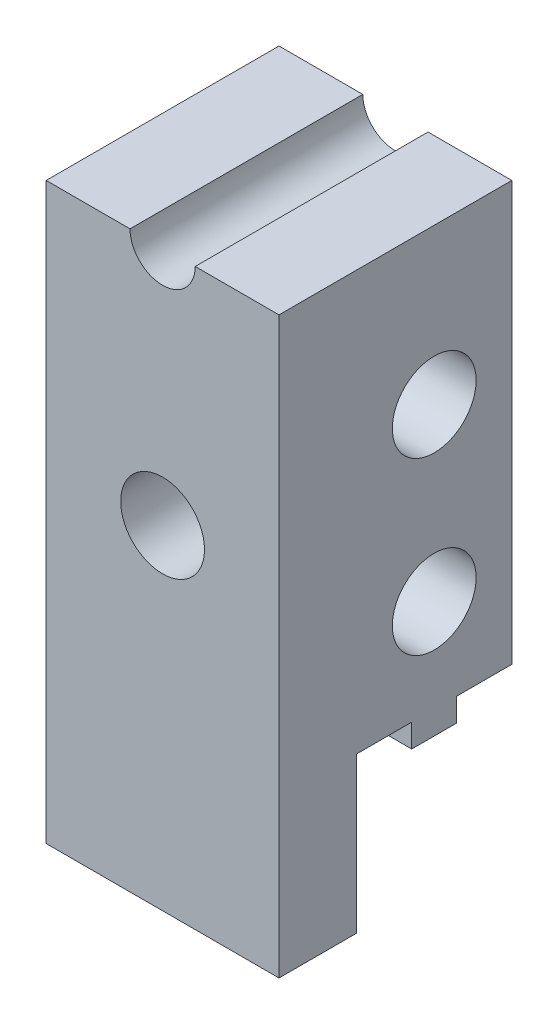
ISO-10303-21;
HEADER;
FILE_DESCRIPTION(('STEP AP214'),'2;1');
FILE_NAME('part.step','',(''),(''),'','','');
FILE_SCHEMA(('AUTOMOTIVE_DESIGN { 1 0 10303 214 1 1 1 1 }'));
ENDSEC;
DATA;
#1=APPLICATION_CONTEXT('core data for automotive mechanical design processes');
#2=APPLICATION_PROTOCOL_DEFINITION('international standard','automotive_design',2000,#1);
#3=PRODUCT_CONTEXT('',#1,'mechanical');
#4=PRODUCT('Part','Part','',(#3));
#5=PRODUCT_RELATED_PRODUCT_CATEGORY('part','',(#4));
#6=PRODUCT_DEFINITION_FORMATION('','',#4);
#7=PRODUCT_DEFINITION_CONTEXT('part definition',#1,'design');
#8=PRODUCT_DEFINITION('design','',#6,#7);
#9=PRODUCT_DEFINITION_SHAPE('','',#8);
#10=(LENGTH_UNIT() NAMED_UNIT(*) SI_UNIT(.MILLI.,.METRE.));
#11=(NAMED_UNIT(*) PLANE_ANGLE_UNIT() SI_UNIT($,.RADIAN.));
#12=(NAMED_UNIT(*) SI_UNIT($,.STERADIAN.) SOLID_ANGLE_UNIT());
#13=UNCERTAINTY_MEASURE_WITH_UNIT(LENGTH_MEASURE(1.E-05),#10,'distance_accuracy_value','');
#14=(GEOMETRIC_REPRESENTATION_CONTEXT(3) GLOBAL_UNCERTAINTY_ASSIGNED_CONTEXT((#13)) GLOBAL_UNIT_ASSIGNED_CONTEXT((#10,
#11,#12)) REPRESENTATION_CONTEXT('',''));
#15=CARTESIAN_POINT('',(0.,0.,0.));
#16=DIRECTION('',(0.,0.,1.));
#17=DIRECTION('',(1.,0.,0.));
#18=AXIS2_PLACEMENT_3D('',#15,#16,#17);
#19=CARTESIAN_POINT('',(30.,-9.15785598684864,-10.));
#20=DIRECTION('',(0.,0.,1.));
#21=DIRECTION('',(1.,0.,0.));
#22=AXIS2_PLACEMENT_3D('',#19,#20,#21);
#23=PLANE('',#22);
#24=CARTESIAN_POINT('',(15.,13.8421440131514,-10.));
#25=DIRECTION('',(0.,0.,1.));
#26=DIRECTION('',(1.,0.,0.));
#27=AXIS2_PLACEMENT_3D('',#24,#25,#26);
#28=CIRCLE('',#27,5.4);
#29=CARTESIAN_POINT('',(20.4,13.8421440131514,-10.));
#30=VERTEX_POINT('',#29);
#31=EDGE_CURVE('E263',#30,#30,#28,.T.);
#32=ORIENTED_EDGE('',*,*,#31,.T.);
#33=EDGE_LOOP('',(#32));
#34=FACE_BOUND('',#33,.T.);
#35=CARTESIAN_POINT('',(15.,44.8421440131514,-10.));
#36=DIRECTION('',(0.,0.,1.));
#37=DIRECTION('',(1.,0.,0.));
#38=AXIS2_PLACEMENT_3D('',#35,#36,#37);
#39=CIRCLE('',#38,4.2);
#40=CARTESIAN_POINT('',(10.8,44.8421440131514,-10.));
#41=VERTEX_POINT('',#40);
#42=CARTESIAN_POINT('',(19.2,44.8421440131514,-10.));
#43=VERTEX_POINT('',#42);
#44=EDGE_CURVE('E212',#41,#43,#39,.T.);
#45=ORIENTED_EDGE('',*,*,#44,.T.);
#46=DIRECTION('',(-1.,0.,0.));
#47=VECTOR('',#46,1.);
#48=CARTESIAN_POINT('',(30.,44.8421440131514,-10.));
#49=LINE('',#48,#47);
#50=CARTESIAN_POINT('',(30.,44.8421440131514,-10.));
#51=VERTEX_POINT('',#50);
#52=EDGE_CURVE('E194',#51,#43,#49,.T.);
#53=ORIENTED_EDGE('',*,*,#52,.F.);
#54=DIRECTION('',(0.,1.,0.));
#55=VECTOR('',#54,1.);
#56=CARTESIAN_POINT('',(30.,-9.15785598684864,-10.));
#57=LINE('',#56,#55);
#58=CARTESIAN_POINT('',(30.,-9.15785598684864,-10.));
#59=VERTEX_POINT('',#58);
#60=EDGE_CURVE('E104',#59,#51,#57,.T.);
#61=ORIENTED_EDGE('',*,*,#60,.F.);
#62=DIRECTION('',(-1.,0.,0.));
#63=VECTOR('',#62,1.);
#64=CARTESIAN_POINT('',(30.,-9.15785598684864,-10.));
#65=LINE('',#64,#63);
#66=CARTESIAN_POINT('',(0.,-9.15785598684864,-10.));
#67=VERTEX_POINT('',#66);
#68=EDGE_CURVE('E41',#59,#67,#65,.T.);
#69=ORIENTED_EDGE('',*,*,#68,.T.);
#70=DIRECTION('',(0.,1.,0.));
#71=VECTOR('',#70,1.);
#72=CARTESIAN_POINT('',(0.,-9.15785598684864,-10.));
#73=LINE('',#72,#71);
#74=CARTESIAN_POINT('',(0.,44.8421440131514,-10.));
#75=VERTEX_POINT('',#74);
#76=EDGE_CURVE('E157',#67,#75,#73,.T.);
#77=ORIENTED_EDGE('',*,*,#76,.T.);
#78=EDGE_CURVE('E193',#41,#75,#49,.T.);
#79=ORIENTED_EDGE('',*,*,#78,.F.);
#80=EDGE_LOOP('',(#45,#53,#61,#69,#77,#79));
#81=FACE_BOUND('',#80,.T.);
#82=ADVANCED_FACE('F33',(#34,#81),#23,.F.);
#83=CARTESIAN_POINT('',(30.,44.8421440131514,20.));
#84=DIRECTION('',(0.,-1.,0.));
#85=DIRECTION('',(0.,0.,-1.));
#86=AXIS2_PLACEMENT_3D('',#83,#84,#85);
#87=PLANE('',#86);
#88=DIRECTION('',(0.,0.,-1.));
#89=VECTOR('',#88,1.);
#90=CARTESIAN_POINT('',(10.8,44.8421440131514,20.));
#91=LINE('',#90,#89);
#92=CARTESIAN_POINT('',(10.8,44.8421440131514,20.));
#93=VERTEX_POINT('',#92);
#94=EDGE_CURVE('E47',#41,#93,#91,.F.);
#95=ORIENTED_EDGE('',*,*,#94,.F.);
#96=ORIENTED_EDGE('',*,*,#78,.T.);
#97=DIRECTION('',(0.,0.,1.));
#98=VECTOR('',#97,1.);
#99=CARTESIAN_POINT('',(0.,44.8421440131514,20.));
#100=LINE('',#99,#98);
#101=CARTESIAN_POINT('',(0.,44.8421440131514,20.));
#102=VERTEX_POINT('',#101);
#103=EDGE_CURVE('E161',#75,#102,#100,.T.);
#104=ORIENTED_EDGE('',*,*,#103,.T.);
#105=DIRECTION('',(-1.,0.,0.));
#106=VECTOR('',#105,1.);
#107=CARTESIAN_POINT('',(30.,44.8421440131514,20.));
#108=LINE('',#107,#106);
#109=EDGE_CURVE('E189',#93,#102,#108,.T.);
#110=ORIENTED_EDGE('',*,*,#109,.F.);
#111=EDGE_LOOP('',(#95,#96,#104,#110));
#112=FACE_BOUND('',#111,.T.);
#113=ADVANCED_FACE('F210',(#112),#87,.F.);
#114=DIRECTION('',(0.,0.,-1.));
#115=VECTOR('',#114,1.);
#116=CARTESIAN_POINT('',(19.2,44.8421440131514,20.));
#117=LINE('',#116,#115);
#118=CARTESIAN_POINT('',(19.2,44.8421440131514,20.));
#119=VERTEX_POINT('',#118);
#120=EDGE_CURVE('E216',#119,#43,#117,.T.);
#121=ORIENTED_EDGE('',*,*,#120,.F.);
#122=CARTESIAN_POINT('',(30.,44.8421440131514,20.));
#123=VERTEX_POINT('',#122);
#124=EDGE_CURVE('E190',#123,#119,#108,.T.);
#125=ORIENTED_EDGE('',*,*,#124,.F.);
#126=DIRECTION('',(0.,0.,1.));
#127=VECTOR('',#126,1.);
#128=CARTESIAN_POINT('',(30.,44.8421440131514,20.));
#129=LINE('',#128,#127);
#130=EDGE_CURVE('E231',#51,#123,#129,.T.);
#131=ORIENTED_EDGE('',*,*,#130,.F.);
#132=ORIENTED_EDGE('',*,*,#52,.T.);
#133=EDGE_LOOP('',(#121,#125,#131,#132));
#134=FACE_BOUND('',#133,.T.);
#135=ADVANCED_FACE('F222',(#134),#87,.F.);
#136=CARTESIAN_POINT('',(30.,44.8421440131514,20.));
#137=DIRECTION('',(0.,0.,-1.));
#138=DIRECTION('',(0.,1.,0.));
#139=AXIS2_PLACEMENT_3D('',#136,#137,#138);
#140=PLANE('',#139);
#141=CARTESIAN_POINT('',(15.,13.8421440131514,20.));
#142=DIRECTION('',(0.,0.,1.));
#143=DIRECTION('',(1.,0.,0.));
#144=AXIS2_PLACEMENT_3D('',#141,#142,#143);
#145=CIRCLE('',#144,5.4);
#146=CARTESIAN_POINT('',(20.4,13.8421440131514,20.));
#147=VERTEX_POINT('',#146);
#148=EDGE_CURVE('E266',#147,#147,#145,.T.);
#149=ORIENTED_EDGE('',*,*,#148,.F.);
#150=EDGE_LOOP('',(#149));
#151=FACE_BOUND('',#150,.T.);
#152=CARTESIAN_POINT('',(15.,44.8421440131514,20.));
#153=DIRECTION('',(0.,0.,-1.));
#154=DIRECTION('',(0.,1.,0.));
#155=AXIS2_PLACEMENT_3D('',#152,#153,#154);
#156=CIRCLE('',#155,4.2);
#157=EDGE_CURVE('E11',#93,#119,#156,.F.);
#158=ORIENTED_EDGE('',*,*,#157,.F.);
#159=ORIENTED_EDGE('',*,*,#109,.T.);
#160=DIRECTION('',(0.,-1.,0.));
#161=VECTOR('',#160,1.);
#162=CARTESIAN_POINT('',(0.,44.8421440131514,20.));
#163=LINE('',#162,#161);
#164=CARTESIAN_POINT('',(0.,-29.1578559868486,20.));
#165=VERTEX_POINT('',#164);
#166=EDGE_CURVE('E164',#102,#165,#163,.T.);
#167=ORIENTED_EDGE('',*,*,#166,.T.);
#168=DIRECTION('',(-1.,0.,0.));
#169=VECTOR('',#168,1.);
#170=CARTESIAN_POINT('',(30.,-29.1578559868486,20.));
#171=LINE('',#170,#169);
#172=CARTESIAN_POINT('',(30.,-29.1578559868486,20.));
#173=VERTEX_POINT('',#172);
#174=EDGE_CURVE('E186',#173,#165,#171,.T.);
#175=ORIENTED_EDGE('',*,*,#174,.F.);
#176=DIRECTION('',(0.,-1.,0.));
#177=VECTOR('',#176,1.);
#178=CARTESIAN_POINT('',(30.,44.8421440131514,20.));
#179=LINE('',#178,#177);
#180=EDGE_CURVE('E228',#123,#173,#179,.T.);
#181=ORIENTED_EDGE('',*,*,#180,.F.);
#182=ORIENTED_EDGE('',*,*,#124,.T.);
#183=EDGE_LOOP('',(#158,#159,#167,#175,#181,#182));
#184=FACE_BOUND('',#183,.T.);
#185=ADVANCED_FACE('F226',(#151,#184),#140,.F.);
#186=CARTESIAN_POINT('',(30.,0.,0.));
#187=DIRECTION('',(1.,0.,0.));
#188=DIRECTION('',(0.,0.,-1.));
#189=AXIS2_PLACEMENT_3D('',#186,#187,#188);
#190=PLANE('',#189);
#191=CARTESIAN_POINT('',(30.,24.8421440131514,0.));
#192=DIRECTION('',(1.,0.,0.));
#193=DIRECTION('',(0.,0.,-1.));
#194=AXIS2_PLACEMENT_3D('',#191,#192,#193);
#195=CIRCLE('',#194,5.4);
#196=CARTESIAN_POINT('',(30.,24.8421440131514,-5.4));
#197=VERTEX_POINT('',#196);
#198=EDGE_CURVE('E158',#197,#197,#195,.T.);
#199=ORIENTED_EDGE('',*,*,#198,.F.);
#200=EDGE_LOOP('',(#199));
#201=FACE_BOUND('',#200,.T.);
#202=DIRECTION('',(0.,0.,-1.));
#203=VECTOR('',#202,1.);
#204=CARTESIAN_POINT('',(30.,-9.15785598684864,-2.9));
#205=LINE('',#204,#203);
#206=CARTESIAN_POINT('',(30.,-9.15785598684864,-2.9));
#207=VERTEX_POINT('',#206);
#208=EDGE_CURVE('E176',#207,#59,#205,.T.);
#209=ORIENTED_EDGE('',*,*,#208,.T.);
#210=ORIENTED_EDGE('',*,*,#60,.T.);
#211=ORIENTED_EDGE('',*,*,#130,.T.);
#212=ORIENTED_EDGE('',*,*,#180,.T.);
#213=DIRECTION('',(0.,0.,-1.));
#214=VECTOR('',#213,1.);
#215=CARTESIAN_POINT('',(30.,-29.1578559868486,10.));
#216=LINE('',#215,#214);
#217=CARTESIAN_POINT('',(30.,-29.1578559868486,10.));
#218=VERTEX_POINT('',#217);
#219=EDGE_CURVE('E230',#173,#218,#216,.T.);
#220=ORIENTED_EDGE('',*,*,#219,.T.);
#221=DIRECTION('',(0.,1.,0.));
#222=VECTOR('',#221,1.);
#223=CARTESIAN_POINT('',(30.,-9.15785598684864,10.));
#224=LINE('',#223,#222);
#225=CARTESIAN_POINT('',(30.,-9.15785598684864,10.));
#226=VERTEX_POINT('',#225);
#227=EDGE_CURVE('E233',#218,#226,#224,.T.);
#228=ORIENTED_EDGE('',*,*,#227,.T.);
#229=DIRECTION('',(0.,0.,-1.));
#230=VECTOR('',#229,1.);
#231=CARTESIAN_POINT('',(30.,-9.15785598684864,10.));
#232=LINE('',#231,#230);
#233=CARTESIAN_POINT('',(30.,-9.15785598684864,2.9));
#234=VERTEX_POINT('',#233);
#235=EDGE_CURVE('E133',#226,#234,#232,.T.);
#236=ORIENTED_EDGE('',*,*,#235,.T.);
#237=DIRECTION('',(0.,-1.,0.));
#238=VECTOR('',#237,1.);
#239=CARTESIAN_POINT('',(30.,-12.1578559868486,2.9));
#240=LINE('',#239,#238);
#241=CARTESIAN_POINT('',(30.,-12.1578559868486,2.9));
#242=VERTEX_POINT('',#241);
#243=EDGE_CURVE('E125',#234,#242,#240,.T.);
#244=ORIENTED_EDGE('',*,*,#243,.T.);
#245=DIRECTION('',(0.,0.,-1.));
#246=VECTOR('',#245,1.);
#247=CARTESIAN_POINT('',(30.,-12.1578559868486,-2.9));
#248=LINE('',#247,#246);
#249=CARTESIAN_POINT('',(30.,-12.1578559868486,-2.9));
#250=VERTEX_POINT('',#249);
#251=EDGE_CURVE('E130',#242,#250,#248,.T.);
#252=ORIENTED_EDGE('',*,*,#251,.T.);
#253=DIRECTION('',(0.,1.,0.));
#254=VECTOR('',#253,1.);
#255=CARTESIAN_POINT('',(30.,-9.15785598684864,-2.9));
#256=LINE('',#255,#254);
#257=EDGE_CURVE('E56',#250,#207,#256,.T.);
#258=ORIENTED_EDGE('',*,*,#257,.T.);
#259=EDGE_LOOP('',(#209,#210,#211,#212,#220,#228,#236,#244,#252,#258));
#260=FACE_BOUND('',#259,.T.);
#261=CARTESIAN_POINT('',(30.,2.84214401315136,0.));
#262=DIRECTION('',(1.,0.,0.));
#263=DIRECTION('',(0.,0.,-1.));
#264=AXIS2_PLACEMENT_3D('',#261,#262,#263);
#265=CIRCLE('',#264,5.4);
#266=CARTESIAN_POINT('',(30.,2.84214401315136,-5.4));
#267=VERTEX_POINT('',#266);
#268=EDGE_CURVE('E253',#267,#267,#265,.T.);
#269=ORIENTED_EDGE('',*,*,#268,.F.);
#270=EDGE_LOOP('',(#269));
#271=FACE_BOUND('',#270,.T.);
#272=ADVANCED_FACE('F127',(#201,#260,#271),#190,.T.);
#273=CARTESIAN_POINT('',(0.,0.,0.));
#274=DIRECTION('',(1.,0.,0.));
#275=DIRECTION('',(0.,0.,-1.));
#276=AXIS2_PLACEMENT_3D('',#273,#274,#275);
#277=PLANE('',#276);
#278=DIRECTION('',(0.,0.,-1.));
#279=VECTOR('',#278,1.);
#280=CARTESIAN_POINT('',(0.,-9.15785598684864,-2.9));
#281=LINE('',#280,#279);
#282=CARTESIAN_POINT('',(0.,-9.15785598684864,-2.9));
#283=VERTEX_POINT('',#282);
#284=EDGE_CURVE('E154',#283,#67,#281,.T.);
#285=ORIENTED_EDGE('',*,*,#284,.F.);
#286=DIRECTION('',(0.,1.,0.));
#287=VECTOR('',#286,1.);
#288=CARTESIAN_POINT('',(0.,-9.15785598684864,-2.9));
#289=LINE('',#288,#287);
#290=CARTESIAN_POINT('',(0.,-12.1578559868486,-2.9));
#291=VERTEX_POINT('',#290);
#292=EDGE_CURVE('E95',#291,#283,#289,.T.);
#293=ORIENTED_EDGE('',*,*,#292,.F.);
#294=DIRECTION('',(0.,0.,-1.));
#295=VECTOR('',#294,1.);
#296=CARTESIAN_POINT('',(0.,-12.1578559868486,-2.9));
#297=LINE('',#296,#295);
#298=CARTESIAN_POINT('',(0.,-12.1578559868486,2.9));
#299=VERTEX_POINT('',#298);
#300=EDGE_CURVE('E173',#299,#291,#297,.T.);
#301=ORIENTED_EDGE('',*,*,#300,.F.);
#302=DIRECTION('',(0.,-1.,0.));
#303=VECTOR('',#302,1.);
#304=CARTESIAN_POINT('',(0.,-12.1578559868486,2.9));
#305=LINE('',#304,#303);
#306=CARTESIAN_POINT('',(0.,-9.15785598684864,2.9));
#307=VERTEX_POINT('',#306);
#308=EDGE_CURVE('E142',#307,#299,#305,.T.);
#309=ORIENTED_EDGE('',*,*,#308,.F.);
#310=DIRECTION('',(0.,0.,-1.));
#311=VECTOR('',#310,1.);
#312=CARTESIAN_POINT('',(0.,-9.15785598684864,10.));
#313=LINE('',#312,#311);
#314=CARTESIAN_POINT('',(0.,-9.15785598684864,10.));
#315=VERTEX_POINT('',#314);
#316=EDGE_CURVE('E170',#315,#307,#313,.T.);
#317=ORIENTED_EDGE('',*,*,#316,.F.);
#318=DIRECTION('',(0.,1.,0.));
#319=VECTOR('',#318,1.);
#320=CARTESIAN_POINT('',(0.,-9.15785598684864,10.));
#321=LINE('',#320,#319);
#322=CARTESIAN_POINT('',(0.,-29.1578559868486,10.));
#323=VERTEX_POINT('',#322);
#324=EDGE_CURVE('E168',#323,#315,#321,.T.);
#325=ORIENTED_EDGE('',*,*,#324,.F.);
#326=DIRECTION('',(0.,0.,-1.));
#327=VECTOR('',#326,1.);
#328=CARTESIAN_POINT('',(0.,-29.1578559868486,10.));
#329=LINE('',#328,#327);
#330=EDGE_CURVE('E166',#165,#323,#329,.T.);
#331=ORIENTED_EDGE('',*,*,#330,.F.);
#332=ORIENTED_EDGE('',*,*,#166,.F.);
#333=ORIENTED_EDGE('',*,*,#103,.F.);
#334=ORIENTED_EDGE('',*,*,#76,.F.);
#335=EDGE_LOOP('',(#285,#293,#301,#309,#317,#325,#331,#332,#333,#334));
#336=FACE_BOUND('',#335,.T.);
#337=CARTESIAN_POINT('',(0.,24.8421440131514,0.));
#338=DIRECTION('',(1.,0.,0.));
#339=DIRECTION('',(0.,0.,-1.));
#340=AXIS2_PLACEMENT_3D('',#337,#338,#339);
#341=CIRCLE('',#340,5.4);
#342=CARTESIAN_POINT('',(0.,24.8421440131514,-5.4));
#343=VERTEX_POINT('',#342);
#344=EDGE_CURVE('E250',#343,#343,#341,.T.);
#345=ORIENTED_EDGE('',*,*,#344,.T.);
#346=EDGE_LOOP('',(#345));
#347=FACE_BOUND('',#346,.T.);
#348=CARTESIAN_POINT('',(0.,2.84214401315136,0.));
#349=DIRECTION('',(1.,0.,0.));
#350=DIRECTION('',(0.,0.,-1.));
#351=AXIS2_PLACEMENT_3D('',#348,#349,#350);
#352=CIRCLE('',#351,5.4);
#353=CARTESIAN_POINT('',(0.,2.84214401315136,-5.4));
#354=VERTEX_POINT('',#353);
#355=EDGE_CURVE('E256',#354,#354,#352,.T.);
#356=ORIENTED_EDGE('',*,*,#355,.T.);
#357=EDGE_LOOP('',(#356));
#358=FACE_BOUND('',#357,.T.);
#359=ADVANCED_FACE('F204',(#336,#347,#358),#277,.F.);
#360=CARTESIAN_POINT('',(30.,-9.15785598684864,-2.9));
#361=DIRECTION('',(0.,1.,0.));
#362=DIRECTION('',(0.,0.,1.));
#363=AXIS2_PLACEMENT_3D('',#360,#361,#362);
#364=PLANE('',#363);
#365=ORIENTED_EDGE('',*,*,#284,.T.);
#366=ORIENTED_EDGE('',*,*,#68,.F.);
#367=ORIENTED_EDGE('',*,*,#208,.F.);
#368=DIRECTION('',(-1.,0.,0.));
#369=VECTOR('',#368,1.);
#370=CARTESIAN_POINT('',(30.,-9.15785598684864,-2.9));
#371=LINE('',#370,#369);
#372=EDGE_CURVE('E150',#207,#283,#371,.T.);
#373=ORIENTED_EDGE('',*,*,#372,.T.);
#374=EDGE_LOOP('',(#365,#366,#367,#373));
#375=FACE_BOUND('',#374,.T.);
#376=ADVANCED_FACE('F35',(#375),#364,.F.);
#377=CARTESIAN_POINT('',(30.,-29.1578559868486,10.));
#378=DIRECTION('',(0.,1.,0.));
#379=DIRECTION('',(0.,0.,1.));
#380=AXIS2_PLACEMENT_3D('',#377,#378,#379);
#381=PLANE('',#380);
#382=ORIENTED_EDGE('',*,*,#330,.T.);
#383=DIRECTION('',(-1.,0.,0.));
#384=VECTOR('',#383,1.);
#385=CARTESIAN_POINT('',(30.,-29.1578559868486,10.));
#386=LINE('',#385,#384);
#387=EDGE_CURVE('E183',#218,#323,#386,.T.);
#388=ORIENTED_EDGE('',*,*,#387,.F.);
#389=ORIENTED_EDGE('',*,*,#219,.F.);
#390=ORIENTED_EDGE('',*,*,#174,.T.);
#391=EDGE_LOOP('',(#382,#388,#389,#390));
#392=FACE_BOUND('',#391,.T.);
#393=ADVANCED_FACE('F315',(#392),#381,.F.);
#394=CARTESIAN_POINT('',(30.,-9.15785598684864,10.));
#395=DIRECTION('',(0.,0.,1.));
#396=DIRECTION('',(1.,0.,0.));
#397=AXIS2_PLACEMENT_3D('',#394,#395,#396);
#398=PLANE('',#397);
#399=ORIENTED_EDGE('',*,*,#324,.T.);
#400=DIRECTION('',(-1.,0.,0.));
#401=VECTOR('',#400,1.);
#402=CARTESIAN_POINT('',(30.,-9.15785598684864,10.));
#403=LINE('',#402,#401);
#404=EDGE_CURVE('E180',#226,#315,#403,.T.);
#405=ORIENTED_EDGE('',*,*,#404,.F.);
#406=ORIENTED_EDGE('',*,*,#227,.F.);
#407=ORIENTED_EDGE('',*,*,#387,.T.);
#408=EDGE_LOOP('',(#399,#405,#406,#407));
#409=FACE_BOUND('',#408,.T.);
#410=ADVANCED_FACE('F242',(#409),#398,.F.);
#411=CARTESIAN_POINT('',(30.,-9.15785598684864,10.));
#412=DIRECTION('',(0.,1.,0.));
#413=DIRECTION('',(0.,0.,1.));
#414=AXIS2_PLACEMENT_3D('',#411,#412,#413);
#415=PLANE('',#414);
#416=ORIENTED_EDGE('',*,*,#316,.T.);
#417=DIRECTION('',(-1.,0.,0.));
#418=VECTOR('',#417,1.);
#419=CARTESIAN_POINT('',(30.,-9.15785598684864,2.9));
#420=LINE('',#419,#418);
#421=EDGE_CURVE('E145',#234,#307,#420,.T.);
#422=ORIENTED_EDGE('',*,*,#421,.F.);
#423=ORIENTED_EDGE('',*,*,#235,.F.);
#424=ORIENTED_EDGE('',*,*,#404,.T.);
#425=EDGE_LOOP('',(#416,#422,#423,#424));
#426=FACE_BOUND('',#425,.T.);
#427=ADVANCED_FACE('F246',(#426),#415,.F.);
#428=CARTESIAN_POINT('',(30.,-12.1578559868486,2.9));
#429=DIRECTION('',(0.,0.,-1.));
#430=DIRECTION('',(0.,1.,0.));
#431=AXIS2_PLACEMENT_3D('',#428,#429,#430);
#432=PLANE('',#431);
#433=ORIENTED_EDGE('',*,*,#308,.T.);
#434=DIRECTION('',(-1.,0.,0.));
#435=VECTOR('',#434,1.);
#436=CARTESIAN_POINT('',(30.,-12.1578559868486,2.9));
#437=LINE('',#436,#435);
#438=EDGE_CURVE('E139',#242,#299,#437,.T.);
#439=ORIENTED_EDGE('',*,*,#438,.F.);
#440=ORIENTED_EDGE('',*,*,#243,.F.);
#441=ORIENTED_EDGE('',*,*,#421,.T.);
#442=EDGE_LOOP('',(#433,#439,#440,#441));
#443=FACE_BOUND('',#442,.T.);
#444=ADVANCED_FACE('F140',(#443),#432,.F.);
#445=CARTESIAN_POINT('',(30.,-12.1578559868486,-2.9));
#446=DIRECTION('',(0.,1.,0.));
#447=DIRECTION('',(0.,0.,1.));
#448=AXIS2_PLACEMENT_3D('',#445,#446,#447);
#449=PLANE('',#448);
#450=ORIENTED_EDGE('',*,*,#300,.T.);
#451=DIRECTION('',(-1.,0.,0.));
#452=VECTOR('',#451,1.);
#453=CARTESIAN_POINT('',(30.,-12.1578559868486,-2.9));
#454=LINE('',#453,#452);
#455=EDGE_CURVE('E146',#250,#291,#454,.T.);
#456=ORIENTED_EDGE('',*,*,#455,.F.);
#457=ORIENTED_EDGE('',*,*,#251,.F.);
#458=ORIENTED_EDGE('',*,*,#438,.T.);
#459=EDGE_LOOP('',(#450,#456,#457,#458));
#460=FACE_BOUND('',#459,.T.);
#461=ADVANCED_FACE('F148',(#460),#449,.F.);
#462=CARTESIAN_POINT('',(30.,-9.15785598684864,-2.9));
#463=DIRECTION('',(0.,0.,1.));
#464=DIRECTION('',(0.,-1.,0.));
#465=AXIS2_PLACEMENT_3D('',#462,#463,#464);
#466=PLANE('',#465);
#467=ORIENTED_EDGE('',*,*,#292,.T.);
#468=ORIENTED_EDGE('',*,*,#372,.F.);
#469=ORIENTED_EDGE('',*,*,#257,.F.);
#470=ORIENTED_EDGE('',*,*,#455,.T.);
#471=EDGE_LOOP('',(#467,#468,#469,#470));
#472=FACE_BOUND('',#471,.T.);
#473=ADVANCED_FACE('F247',(#472),#466,.F.);
#474=CARTESIAN_POINT('',(30.,24.8421440131514,0.));
#475=DIRECTION('',(-1.,0.,0.));
#476=DIRECTION('',(0.,0.,1.));
#477=AXIS2_PLACEMENT_3D('',#474,#475,#476);
#478=CYLINDRICAL_SURFACE('',#477,5.4);
#479=ORIENTED_EDGE('',*,*,#198,.T.);
#480=EDGE_LOOP('',(#479));
#481=FACE_BOUND('',#480,.T.);
#482=ORIENTED_EDGE('',*,*,#344,.F.);
#483=EDGE_LOOP('',(#482));
#484=FACE_BOUND('',#483,.T.);
#485=ADVANCED_FACE('F299',(#481,#484),#478,.F.);
#486=CARTESIAN_POINT('',(30.,2.84214401315136,0.));
#487=DIRECTION('',(-1.,0.,0.));
#488=DIRECTION('',(0.,0.,1.));
#489=AXIS2_PLACEMENT_3D('',#486,#487,#488);
#490=CYLINDRICAL_SURFACE('',#489,5.4);
#491=ORIENTED_EDGE('',*,*,#268,.T.);
#492=EDGE_LOOP('',(#491));
#493=FACE_BOUND('',#492,.T.);
#494=ORIENTED_EDGE('',*,*,#355,.F.);
#495=EDGE_LOOP('',(#494));
#496=FACE_BOUND('',#495,.T.);
#497=ADVANCED_FACE('F294',(#493,#496),#490,.F.);
#498=CARTESIAN_POINT('',(15.,44.8421440131514,20.));
#499=DIRECTION('',(0.,0.,-1.));
#500=DIRECTION('',(-1.,0.,0.));
#501=AXIS2_PLACEMENT_3D('',#498,#499,#500);
#502=CYLINDRICAL_SURFACE('',#501,4.2);
#503=ORIENTED_EDGE('',*,*,#94,.T.);
#504=ORIENTED_EDGE('',*,*,#157,.T.);
#505=ORIENTED_EDGE('',*,*,#120,.T.);
#506=ORIENTED_EDGE('',*,*,#44,.F.);
#507=EDGE_LOOP('',(#503,#504,#505,#506));
#508=FACE_BOUND('',#507,.T.);
#509=ADVANCED_FACE('F218',(#508),#502,.F.);
#510=CARTESIAN_POINT('',(15.,13.8421440131514,-30.));
#511=DIRECTION('',(0.,0.,1.));
#512=DIRECTION('',(1.,0.,0.));
#513=AXIS2_PLACEMENT_3D('',#510,#511,#512);
#514=CYLINDRICAL_SURFACE('',#513,5.4);
#515=ORIENTED_EDGE('',*,*,#148,.T.);
#516=EDGE_LOOP('',(#515));
#517=FACE_BOUND('',#516,.T.);
#518=ORIENTED_EDGE('',*,*,#31,.F.);
#519=EDGE_LOOP('',(#518));
#520=FACE_BOUND('',#519,.T.);
#521=ADVANCED_FACE('F270',(#517,#520),#514,.F.);
#522=CLOSED_SHELL('',(#82,#113,#135,#185,#272,#359,#376,#393,#410,#427,#444,#461,#473,#485,#497,
#509,#521));
#523=MANIFOLD_SOLID_BREP('B2',#522);
#524=ADVANCED_BREP_SHAPE_REPRESENTATION('',(#18,#523),#14);
#525=SHAPE_DEFINITION_REPRESENTATION(#9,#524);
ENDSEC;
END-ISO-10303-21;
